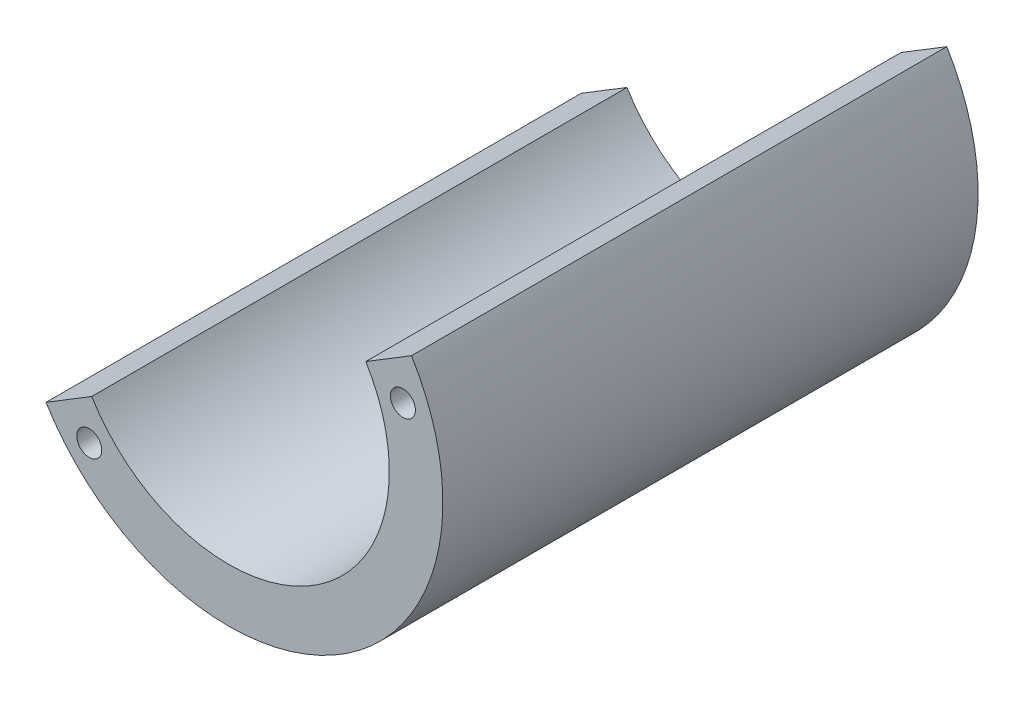
ISO-10303-21;
HEADER;
FILE_DESCRIPTION(('STEP AP214'),'2;1');
FILE_NAME('part.step','',(''),(''),'','','');
FILE_SCHEMA(('AUTOMOTIVE_DESIGN { 1 0 10303 214 1 1 1 1 }'));
ENDSEC;
DATA;
#1=APPLICATION_CONTEXT('core data for automotive mechanical design processes');
#2=APPLICATION_PROTOCOL_DEFINITION('international standard','automotive_design',2000,#1);
#3=PRODUCT_CONTEXT('',#1,'mechanical');
#4=PRODUCT('Part','Part','',(#3));
#5=PRODUCT_RELATED_PRODUCT_CATEGORY('part','',(#4));
#6=PRODUCT_DEFINITION_FORMATION('','',#4);
#7=PRODUCT_DEFINITION_CONTEXT('part definition',#1,'design');
#8=PRODUCT_DEFINITION('design','',#6,#7);
#9=PRODUCT_DEFINITION_SHAPE('','',#8);
#10=(LENGTH_UNIT() NAMED_UNIT(*) SI_UNIT(.MILLI.,.METRE.));
#11=(NAMED_UNIT(*) PLANE_ANGLE_UNIT() SI_UNIT($,.RADIAN.));
#12=(NAMED_UNIT(*) SI_UNIT($,.STERADIAN.) SOLID_ANGLE_UNIT());
#13=UNCERTAINTY_MEASURE_WITH_UNIT(LENGTH_MEASURE(1.E-05),#10,'distance_accuracy_value','');
#14=(GEOMETRIC_REPRESENTATION_CONTEXT(3) GLOBAL_UNCERTAINTY_ASSIGNED_CONTEXT((#13)) GLOBAL_UNIT_ASSIGNED_CONTEXT((#10,
#11,#12)) REPRESENTATION_CONTEXT('',''));
#15=CARTESIAN_POINT('',(0.,0.,0.));
#16=DIRECTION('',(0.,0.,1.));
#17=DIRECTION('',(1.,0.,0.));
#18=AXIS2_PLACEMENT_3D('',#15,#16,#17);
#19=CARTESIAN_POINT('',(556.905857435,570.878625051,0.));
#20=DIRECTION('',(0.521065785002236,-0.853516518703653,0.));
#21=DIRECTION('',(0.853516518703653,0.521065785002236,0.));
#22=AXIS2_PLACEMENT_3D('',#19,#20,#21);
#23=PLANE('',#22);
#24=DIRECTION('',(0.,0.,1.));
#25=VECTOR('',#24,1.);
#26=CARTESIAN_POINT('',(556.905857421038,570.878625071725,100.));
#27=LINE('',#26,#25);
#28=CARTESIAN_POINT('',(556.905857431518,570.878625054559,200.));
#29=VERTEX_POINT('',#28);
#30=CARTESIAN_POINT('',(556.905857427542,570.878625061071,0.));
#31=VERTEX_POINT('',#30);
#32=EDGE_CURVE('E71',#29,#31,#27,.F.);
#33=ORIENTED_EDGE('',*,*,#32,.F.);
#34=DIRECTION('',(-0.853516518756703,-0.52106578491534,0.));
#35=VECTOR('',#34,1.);
#36=CARTESIAN_POINT('',(573.976187791458,581.299940720026,200.));
#37=LINE('',#36,#35);
#38=CARTESIAN_POINT('',(573.976187803924,581.299940757333,200.));
#39=VERTEX_POINT('',#38);
#40=EDGE_CURVE('E68',#39,#29,#37,.T.);
#41=ORIENTED_EDGE('',*,*,#40,.F.);
#42=DIRECTION('',(0.,0.,1.));
#43=VECTOR('',#42,1.);
#44=CARTESIAN_POINT('',(573.976187790717,581.299940778967,100.));
#45=LINE('',#44,#43);
#46=CARTESIAN_POINT('',(573.976187799418,581.299940764715,0.));
#47=VERTEX_POINT('',#46);
#48=EDGE_CURVE('E58',#39,#47,#45,.F.);
#49=ORIENTED_EDGE('',*,*,#48,.T.);
#50=DIRECTION('',(0.853516518703653,0.521065785002236,0.));
#51=VECTOR('',#50,1.);
#52=CARTESIAN_POINT('',(556.905857435,570.878625051,0.));
#53=LINE('',#52,#51);
#54=EDGE_CURVE('E80',#47,#31,#53,.F.);
#55=ORIENTED_EDGE('',*,*,#54,.T.);
#56=EDGE_LOOP('',(#33,#41,#49,#55));
#57=FACE_BOUND('',#56,.T.);
#58=ADVANCED_FACE('F16',(#57),#23,.F.);
#59=CARTESIAN_POINT('',(505.694866312,539.61467795,200.));
#60=DIRECTION('',(0.,0.,-1.));
#61=DIRECTION('',(-1.,0.,0.));
#62=AXIS2_PLACEMENT_3D('',#59,#60,#61);
#63=CYLINDRICAL_SURFACE('',#62,59.9999999999999);
#64=CARTESIAN_POINT('',(505.694866312,539.61467795,200.));
#65=DIRECTION('',(0.,0.,-1.));
#66=DIRECTION('',(-1.,0.,0.));
#67=AXIS2_PLACEMENT_3D('',#64,#65,#66);
#68=CIRCLE('',#67,59.9999999999999);
#69=CARTESIAN_POINT('',(454.483875197609,508.350730837289,200.));
#70=VERTEX_POINT('',#69);
#71=EDGE_CURVE('E73',#29,#70,#68,.T.);
#72=ORIENTED_EDGE('',*,*,#71,.F.);
#73=ORIENTED_EDGE('',*,*,#32,.T.);
#74=CARTESIAN_POINT('',(505.694866312,539.61467795,0.));
#75=DIRECTION('',(0.,0.,-1.));
#76=DIRECTION('',(-1.,0.,0.));
#77=AXIS2_PLACEMENT_3D('',#74,#75,#76);
#78=CIRCLE('',#77,59.9999999999999);
#79=CARTESIAN_POINT('',(454.48387518989,508.350730849933,0.));
#80=VERTEX_POINT('',#79);
#81=EDGE_CURVE('E82',#31,#80,#78,.T.);
#82=ORIENTED_EDGE('',*,*,#81,.T.);
#83=DIRECTION('',(0.,0.,1.));
#84=VECTOR('',#83,1.);
#85=CARTESIAN_POINT('',(454.48387519,508.35073085,100.));
#86=LINE('',#85,#84);
#87=EDGE_CURVE('E94',#80,#70,#86,.T.);
#88=ORIENTED_EDGE('',*,*,#87,.T.);
#89=EDGE_LOOP('',(#72,#73,#82,#88));
#90=FACE_BOUND('',#89,.T.);
#91=ADVANCED_FACE('F98',(#90),#63,.F.);
#92=CARTESIAN_POINT('',(437.413544816,497.92941515,0.));
#93=DIRECTION('',(0.521065785002235,-0.853516518703654,0.));
#94=DIRECTION('',(0.853516518703654,0.521065785002235,0.));
#95=AXIS2_PLACEMENT_3D('',#92,#93,#94);
#96=PLANE('',#95);
#97=DIRECTION('',(0.,0.,-1.));
#98=VECTOR('',#97,1.);
#99=CARTESIAN_POINT('',(437.413544816183,497.929415149042,100.));
#100=LINE('',#99,#98);
#101=CARTESIAN_POINT('',(437.413544815945,497.929415149432,0.));
#102=VERTEX_POINT('',#101);
#103=CARTESIAN_POINT('',(437.413544823134,497.929415137657,200.));
#104=VERTEX_POINT('',#103);
#105=EDGE_CURVE('E35',#102,#104,#100,.F.);
#106=ORIENTED_EDGE('',*,*,#105,.T.);
#107=DIRECTION('',(-0.853516518756701,-0.521065784915343,0.));
#108=VECTOR('',#107,1.);
#109=CARTESIAN_POINT('',(454.483875201331,508.350730822205,200.));
#110=LINE('',#109,#108);
#111=EDGE_CURVE('E70',#70,#104,#110,.T.);
#112=ORIENTED_EDGE('',*,*,#111,.F.);
#113=ORIENTED_EDGE('',*,*,#87,.F.);
#114=DIRECTION('',(0.853516518703654,0.521065785002235,0.));
#115=VECTOR('',#114,1.);
#116=CARTESIAN_POINT('',(437.413544816,497.92941515,0.));
#117=LINE('',#116,#115);
#118=EDGE_CURVE('E85',#80,#102,#117,.F.);
#119=ORIENTED_EDGE('',*,*,#118,.T.);
#120=EDGE_LOOP('',(#106,#112,#113,#119));
#121=FACE_BOUND('',#120,.T.);
#122=ADVANCED_FACE('F101',(#121),#96,.F.);
#123=CARTESIAN_POINT('',(505.694866312,539.61467795,200.));
#124=DIRECTION('',(0.,0.,-1.));
#125=DIRECTION('',(-1.,0.,0.));
#126=AXIS2_PLACEMENT_3D('',#123,#124,#125);
#127=CYLINDRICAL_SURFACE('',#126,80.);
#128=ORIENTED_EDGE('',*,*,#48,.F.);
#129=CARTESIAN_POINT('',(505.694866312,539.61467795,200.));
#130=DIRECTION('',(0.,0.,-1.));
#131=DIRECTION('',(-1.,0.,0.));
#132=AXIS2_PLACEMENT_3D('',#129,#130,#131);
#133=CIRCLE('',#132,80.);
#134=EDGE_CURVE('E20',#104,#39,#133,.F.);
#135=ORIENTED_EDGE('',*,*,#134,.F.);
#136=ORIENTED_EDGE('',*,*,#105,.F.);
#137=CARTESIAN_POINT('',(505.694866312,539.61467795,0.));
#138=DIRECTION('',(0.,0.,-1.));
#139=DIRECTION('',(-1.,0.,0.));
#140=AXIS2_PLACEMENT_3D('',#137,#138,#139);
#141=CIRCLE('',#140,80.);
#142=EDGE_CURVE('E61',#102,#47,#141,.F.);
#143=ORIENTED_EDGE('',*,*,#142,.T.);
#144=EDGE_LOOP('',(#128,#135,#136,#143));
#145=FACE_BOUND('',#144,.T.);
#146=ADVANCED_FACE('F60',(#145),#127,.T.);
#147=CARTESIAN_POINT('',(570.761647984,564.37401519,200.));
#148=DIRECTION('',(0.,0.,-1.));
#149=DIRECTION('',(-1.,0.,0.));
#150=AXIS2_PLACEMENT_3D('',#147,#148,#149);
#151=CYLINDRICAL_SURFACE('',#150,4.67005807799981);
#152=CARTESIAN_POINT('',(570.761647984,564.37401519,0.));
#153=DIRECTION('',(0.,0.,-1.));
#154=DIRECTION('',(-1.,0.,0.));
#155=AXIS2_PLACEMENT_3D('',#152,#153,#154);
#156=CIRCLE('',#155,4.67005807799981);
#157=CARTESIAN_POINT('',(566.091589906,564.37401519,0.));
#158=VERTEX_POINT('',#157);
#159=EDGE_CURVE('E88',#158,#158,#156,.T.);
#160=ORIENTED_EDGE('',*,*,#159,.T.);
#161=EDGE_LOOP('',(#160));
#162=FACE_BOUND('',#161,.T.);
#163=CARTESIAN_POINT('',(570.761647984,564.37401519,200.));
#164=DIRECTION('',(0.,0.,-1.));
#165=DIRECTION('',(-1.,0.,0.));
#166=AXIS2_PLACEMENT_3D('',#163,#164,#165);
#167=CIRCLE('',#166,4.67005807799981);
#168=CARTESIAN_POINT('',(566.091589906,564.37401519,200.));
#169=VERTEX_POINT('',#168);
#170=EDGE_CURVE('E77',#169,#169,#167,.T.);
#171=ORIENTED_EDGE('',*,*,#170,.F.);
#172=EDGE_LOOP('',(#171));
#173=FACE_BOUND('',#172,.T.);
#174=ADVANCED_FACE('F109',(#162,#173),#151,.F.);
#175=CARTESIAN_POINT('',(436.523856887,458.884566374,200.));
#176=DIRECTION('',(0.,0.,1.));
#177=DIRECTION('',(1.,0.,0.));
#178=AXIS2_PLACEMENT_3D('',#175,#176,#177);
#179=PLANE('',#178);
#180=CARTESIAN_POINT('',(453.571453557,492.830232128,200.));
#181=DIRECTION('',(0.,0.,-1.));
#182=DIRECTION('',(-1.,0.,0.));
#183=AXIS2_PLACEMENT_3D('',#180,#181,#182);
#184=CIRCLE('',#183,4.67005807900006);
#185=CARTESIAN_POINT('',(448.901395478,492.830232128,200.));
#186=VERTEX_POINT('',#185);
#187=EDGE_CURVE('E26',#186,#186,#184,.F.);
#188=ORIENTED_EDGE('',*,*,#187,.F.);
#189=EDGE_LOOP('',(#188));
#190=FACE_BOUND('',#189,.T.);
#191=ORIENTED_EDGE('',*,*,#170,.T.);
#192=EDGE_LOOP('',(#191));
#193=FACE_BOUND('',#192,.T.);
#194=ORIENTED_EDGE('',*,*,#71,.T.);
#195=ORIENTED_EDGE('',*,*,#111,.T.);
#196=ORIENTED_EDGE('',*,*,#134,.T.);
#197=ORIENTED_EDGE('',*,*,#40,.T.);
#198=EDGE_LOOP('',(#194,#195,#196,#197));
#199=FACE_BOUND('',#198,.T.);
#200=ADVANCED_FACE('F67',(#190,#193,#199),#179,.T.);
#201=CARTESIAN_POINT('',(436.523856887,458.884566374,0.));
#202=DIRECTION('',(0.,0.,1.));
#203=DIRECTION('',(1.,0.,0.));
#204=AXIS2_PLACEMENT_3D('',#201,#202,#203);
#205=PLANE('',#204);
#206=CARTESIAN_POINT('',(453.571453557,492.830232128,0.));
#207=DIRECTION('',(0.,0.,-1.));
#208=DIRECTION('',(-1.,0.,0.));
#209=AXIS2_PLACEMENT_3D('',#206,#207,#208);
#210=CIRCLE('',#209,4.67005807900006);
#211=CARTESIAN_POINT('',(448.901395478,492.830232128,0.));
#212=VERTEX_POINT('',#211);
#213=EDGE_CURVE('E10',#212,#212,#210,.T.);
#214=ORIENTED_EDGE('',*,*,#213,.F.);
#215=EDGE_LOOP('',(#214));
#216=FACE_BOUND('',#215,.T.);
#217=ORIENTED_EDGE('',*,*,#159,.F.);
#218=EDGE_LOOP('',(#217));
#219=FACE_BOUND('',#218,.T.);
#220=ORIENTED_EDGE('',*,*,#118,.F.);
#221=ORIENTED_EDGE('',*,*,#81,.F.);
#222=ORIENTED_EDGE('',*,*,#54,.F.);
#223=ORIENTED_EDGE('',*,*,#142,.F.);
#224=EDGE_LOOP('',(#220,#221,#222,#223));
#225=FACE_BOUND('',#224,.T.);
#226=ADVANCED_FACE('F18',(#216,#219,#225),#205,.F.);
#227=CARTESIAN_POINT('',(453.571453557,492.830232128,200.));
#228=DIRECTION('',(0.,0.,-1.));
#229=DIRECTION('',(-1.,0.,0.));
#230=AXIS2_PLACEMENT_3D('',#227,#228,#229);
#231=CYLINDRICAL_SURFACE('',#230,4.67005807900006);
#232=ORIENTED_EDGE('',*,*,#213,.T.);
#233=EDGE_LOOP('',(#232));
#234=FACE_BOUND('',#233,.T.);
#235=ORIENTED_EDGE('',*,*,#187,.T.);
#236=EDGE_LOOP('',(#235));
#237=FACE_BOUND('',#236,.T.);
#238=ADVANCED_FACE('F113',(#234,#237),#231,.F.);
#239=CLOSED_SHELL('',(#58,#91,#122,#146,#174,#200,#226,#238));
#240=MANIFOLD_SOLID_BREP('B1',#239);
#241=ADVANCED_BREP_SHAPE_REPRESENTATION('',(#18,#240),#14);
#242=SHAPE_DEFINITION_REPRESENTATION(#9,#241);
ENDSEC;
END-ISO-10303-21;
